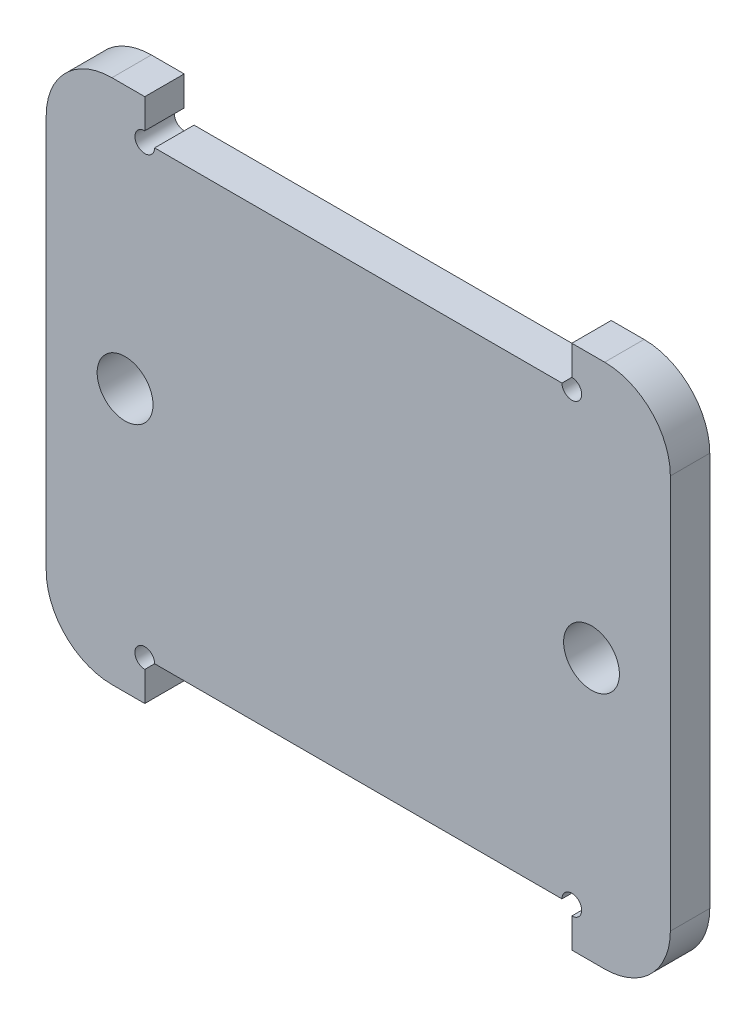
ISO-10303-21;
HEADER;
FILE_DESCRIPTION(('STEP AP214'),'2;1');
FILE_NAME('part.step','',(''),(''),'','','');
FILE_SCHEMA(('AUTOMOTIVE_DESIGN { 1 0 10303 214 1 1 1 1 }'));
ENDSEC;
DATA;
#1=APPLICATION_CONTEXT('core data for automotive mechanical design processes');
#2=APPLICATION_PROTOCOL_DEFINITION('international standard','automotive_design',2000,#1);
#3=PRODUCT_CONTEXT('',#1,'mechanical');
#4=PRODUCT('Part','Part','',(#3));
#5=PRODUCT_RELATED_PRODUCT_CATEGORY('part','',(#4));
#6=PRODUCT_DEFINITION_FORMATION('','',#4);
#7=PRODUCT_DEFINITION_CONTEXT('part definition',#1,'design');
#8=PRODUCT_DEFINITION('design','',#6,#7);
#9=PRODUCT_DEFINITION_SHAPE('','',#8);
#10=(LENGTH_UNIT() NAMED_UNIT(*) SI_UNIT(.MILLI.,.METRE.));
#11=(NAMED_UNIT(*) PLANE_ANGLE_UNIT() SI_UNIT($,.RADIAN.));
#12=(NAMED_UNIT(*) SI_UNIT($,.STERADIAN.) SOLID_ANGLE_UNIT());
#13=UNCERTAINTY_MEASURE_WITH_UNIT(LENGTH_MEASURE(1.E-05),#10,'distance_accuracy_value','');
#14=(GEOMETRIC_REPRESENTATION_CONTEXT(3) GLOBAL_UNCERTAINTY_ASSIGNED_CONTEXT((#13)) GLOBAL_UNIT_ASSIGNED_CONTEXT((#10,
#11,#12)) REPRESENTATION_CONTEXT('',''));
#15=CARTESIAN_POINT('',(0.,0.,0.));
#16=DIRECTION('',(0.,0.,1.));
#17=DIRECTION('',(1.,0.,0.));
#18=AXIS2_PLACEMENT_3D('',#15,#16,#17);
#19=CARTESIAN_POINT('',(32.5,-34.,6.));
#20=DIRECTION('',(0.,0.,1.));
#21=DIRECTION('',(1.,0.,0.));
#22=AXIS2_PLACEMENT_3D('',#19,#20,#21);
#23=PLANE('',#22);
#24=CARTESIAN_POINT('',(35.5,0.,6.));
#25=DIRECTION('',(0.,0.,1.));
#26=DIRECTION('',(-1.,0.,0.));
#27=AXIS2_PLACEMENT_3D('',#24,#25,#26);
#28=CIRCLE('',#27,4.25000000000001);
#29=CARTESIAN_POINT('',(31.25,0.,6.));
#30=VERTEX_POINT('',#29);
#31=EDGE_CURVE('E236',#30,#30,#28,.T.);
#32=ORIENTED_EDGE('',*,*,#31,.F.);
#33=EDGE_LOOP('',(#32));
#34=FACE_BOUND('',#33,.T.);
#35=DIRECTION('',(0.,-1.,0.));
#36=VECTOR('',#35,1.);
#37=CARTESIAN_POINT('',(-47.5,-40.,6.));
#38=LINE('',#37,#36);
#39=CARTESIAN_POINT('',(-47.5,30.,6.));
#40=VERTEX_POINT('',#39);
#41=CARTESIAN_POINT('',(-47.5,-30.,6.));
#42=VERTEX_POINT('',#41);
#43=EDGE_CURVE('E328',#40,#42,#38,.T.);
#44=ORIENTED_EDGE('',*,*,#43,.T.);
#45=CARTESIAN_POINT('',(-37.5,-30.,6.));
#46=DIRECTION('',(0.,0.,1.));
#47=DIRECTION('',(1.,0.,0.));
#48=AXIS2_PLACEMENT_3D('',#45,#46,#47);
#49=CIRCLE('',#48,10.);
#50=CARTESIAN_POINT('',(-37.5,-40.,6.));
#51=VERTEX_POINT('',#50);
#52=EDGE_CURVE('E221',#42,#51,#49,.T.);
#53=ORIENTED_EDGE('',*,*,#52,.T.);
#54=DIRECTION('',(1.,0.,0.));
#55=VECTOR('',#54,1.);
#56=CARTESIAN_POINT('',(-47.5,-40.,6.));
#57=LINE('',#56,#55);
#58=CARTESIAN_POINT('',(-32.5,-40.,6.));
#59=VERTEX_POINT('',#58);
#60=EDGE_CURVE('E334',#51,#59,#57,.T.);
#61=ORIENTED_EDGE('',*,*,#60,.T.);
#62=DIRECTION('',(0.,1.,0.));
#63=VECTOR('',#62,1.);
#64=CARTESIAN_POINT('',(-32.5,-40.,6.));
#65=LINE('',#64,#63);
#66=CARTESIAN_POINT('',(-32.5,-35.5,6.));
#67=VERTEX_POINT('',#66);
#68=EDGE_CURVE('E336',#59,#67,#65,.T.);
#69=ORIENTED_EDGE('',*,*,#68,.T.);
#70=CARTESIAN_POINT('',(-32.5,-34.,6.));
#71=DIRECTION('',(0.,0.,-1.));
#72=DIRECTION('',(-1.,0.,0.));
#73=AXIS2_PLACEMENT_3D('',#70,#71,#72);
#74=CIRCLE('',#73,1.5);
#75=CARTESIAN_POINT('',(-31.,-34.,6.));
#76=VERTEX_POINT('',#75);
#77=EDGE_CURVE('E338',#67,#76,#74,.T.);
#78=ORIENTED_EDGE('',*,*,#77,.T.);
#79=DIRECTION('',(1.,0.,0.));
#80=VECTOR('',#79,1.);
#81=CARTESIAN_POINT('',(-31.,-34.,6.));
#82=LINE('',#81,#80);
#83=CARTESIAN_POINT('',(31.,-34.,6.));
#84=VERTEX_POINT('',#83);
#85=EDGE_CURVE('E340',#76,#84,#82,.T.);
#86=ORIENTED_EDGE('',*,*,#85,.T.);
#87=CARTESIAN_POINT('',(32.5,-34.,6.));
#88=DIRECTION('',(0.,0.,-1.));
#89=DIRECTION('',(1.,0.,0.));
#90=AXIS2_PLACEMENT_3D('',#87,#88,#89);
#91=CIRCLE('',#90,1.5);
#92=CARTESIAN_POINT('',(32.5,-35.5,6.));
#93=VERTEX_POINT('',#92);
#94=EDGE_CURVE('E342',#84,#93,#91,.T.);
#95=ORIENTED_EDGE('',*,*,#94,.T.);
#96=DIRECTION('',(0.,-1.,0.));
#97=VECTOR('',#96,1.);
#98=CARTESIAN_POINT('',(32.5,-40.,6.));
#99=LINE('',#98,#97);
#100=CARTESIAN_POINT('',(32.5,-40.,6.));
#101=VERTEX_POINT('',#100);
#102=EDGE_CURVE('E344',#93,#101,#99,.T.);
#103=ORIENTED_EDGE('',*,*,#102,.T.);
#104=DIRECTION('',(1.,0.,0.));
#105=VECTOR('',#104,1.);
#106=CARTESIAN_POINT('',(32.5,-40.,6.));
#107=LINE('',#106,#105);
#108=CARTESIAN_POINT('',(37.5,-40.,6.));
#109=VERTEX_POINT('',#108);
#110=EDGE_CURVE('E345',#101,#109,#107,.T.);
#111=ORIENTED_EDGE('',*,*,#110,.T.);
#112=CARTESIAN_POINT('',(37.5,-30.,6.));
#113=DIRECTION('',(0.,0.,1.));
#114=DIRECTION('',(1.,0.,0.));
#115=AXIS2_PLACEMENT_3D('',#112,#113,#114);
#116=CIRCLE('',#115,10.);
#117=CARTESIAN_POINT('',(47.5,-30.,6.));
#118=VERTEX_POINT('',#117);
#119=EDGE_CURVE('E55',#109,#118,#116,.T.);
#120=ORIENTED_EDGE('',*,*,#119,.T.);
#121=DIRECTION('',(0.,1.,0.));
#122=VECTOR('',#121,1.);
#123=CARTESIAN_POINT('',(47.5,-40.,6.));
#124=LINE('',#123,#122);
#125=CARTESIAN_POINT('',(47.5,30.,6.));
#126=VERTEX_POINT('',#125);
#127=EDGE_CURVE('E244',#118,#126,#124,.T.);
#128=ORIENTED_EDGE('',*,*,#127,.T.);
#129=CARTESIAN_POINT('',(37.5,30.,6.));
#130=DIRECTION('',(0.,0.,1.));
#131=DIRECTION('',(1.,0.,0.));
#132=AXIS2_PLACEMENT_3D('',#129,#130,#131);
#133=CIRCLE('',#132,10.);
#134=CARTESIAN_POINT('',(37.5,40.,6.));
#135=VERTEX_POINT('',#134);
#136=EDGE_CURVE('E176',#126,#135,#133,.T.);
#137=ORIENTED_EDGE('',*,*,#136,.T.);
#138=DIRECTION('',(-1.,0.,0.));
#139=VECTOR('',#138,1.);
#140=CARTESIAN_POINT('',(32.5,40.,6.));
#141=LINE('',#140,#139);
#142=CARTESIAN_POINT('',(32.5,40.,6.));
#143=VERTEX_POINT('',#142);
#144=EDGE_CURVE('E169',#135,#143,#141,.T.);
#145=ORIENTED_EDGE('',*,*,#144,.T.);
#146=DIRECTION('',(0.,-1.,0.));
#147=VECTOR('',#146,1.);
#148=CARTESIAN_POINT('',(32.5,40.,6.));
#149=LINE('',#148,#147);
#150=CARTESIAN_POINT('',(32.5,35.5,6.));
#151=VERTEX_POINT('',#150);
#152=EDGE_CURVE('E173',#143,#151,#149,.T.);
#153=ORIENTED_EDGE('',*,*,#152,.T.);
#154=CARTESIAN_POINT('',(32.5,34.,6.));
#155=DIRECTION('',(0.,0.,-1.));
#156=DIRECTION('',(-1.,0.,0.));
#157=AXIS2_PLACEMENT_3D('',#154,#155,#156);
#158=CIRCLE('',#157,1.5);
#159=CARTESIAN_POINT('',(31.,34.,6.));
#160=VERTEX_POINT('',#159);
#161=EDGE_CURVE('E190',#151,#160,#158,.T.);
#162=ORIENTED_EDGE('',*,*,#161,.T.);
#163=DIRECTION('',(-1.,0.,0.));
#164=VECTOR('',#163,1.);
#165=CARTESIAN_POINT('',(-31.,34.,6.));
#166=LINE('',#165,#164);
#167=CARTESIAN_POINT('',(-31.,34.,6.));
#168=VERTEX_POINT('',#167);
#169=EDGE_CURVE('E309',#160,#168,#166,.T.);
#170=ORIENTED_EDGE('',*,*,#169,.T.);
#171=CARTESIAN_POINT('',(-32.5,34.,6.));
#172=DIRECTION('',(0.,0.,-1.));
#173=DIRECTION('',(1.,0.,0.));
#174=AXIS2_PLACEMENT_3D('',#171,#172,#173);
#175=CIRCLE('',#174,1.5);
#176=CARTESIAN_POINT('',(-32.5,35.5,6.));
#177=VERTEX_POINT('',#176);
#178=EDGE_CURVE('E326',#168,#177,#175,.T.);
#179=ORIENTED_EDGE('',*,*,#178,.T.);
#180=DIRECTION('',(0.,1.,0.));
#181=VECTOR('',#180,1.);
#182=CARTESIAN_POINT('',(-32.5,40.,6.));
#183=LINE('',#182,#181);
#184=CARTESIAN_POINT('',(-32.5,40.,6.));
#185=VERTEX_POINT('',#184);
#186=EDGE_CURVE('E322',#177,#185,#183,.T.);
#187=ORIENTED_EDGE('',*,*,#186,.T.);
#188=DIRECTION('',(-1.,0.,0.));
#189=VECTOR('',#188,1.);
#190=CARTESIAN_POINT('',(-47.5,40.,6.));
#191=LINE('',#190,#189);
#192=CARTESIAN_POINT('',(-37.5,40.,6.));
#193=VERTEX_POINT('',#192);
#194=EDGE_CURVE('E325',#185,#193,#191,.T.);
#195=ORIENTED_EDGE('',*,*,#194,.T.);
#196=CARTESIAN_POINT('',(-37.5,30.,6.));
#197=DIRECTION('',(0.,0.,1.));
#198=DIRECTION('',(1.,0.,0.));
#199=AXIS2_PLACEMENT_3D('',#196,#197,#198);
#200=CIRCLE('',#199,10.);
#201=EDGE_CURVE('E217',#193,#40,#200,.T.);
#202=ORIENTED_EDGE('',*,*,#201,.T.);
#203=EDGE_LOOP('',(#44,#53,#61,#69,#78,#86,#95,#103,#111,#120,#128,#137,#145,#153,#162,#170,
#179,#187,#195,#202));
#204=FACE_BOUND('',#203,.T.);
#205=CARTESIAN_POINT('',(-35.5,0.,6.));
#206=DIRECTION('',(0.,0.,1.));
#207=DIRECTION('',(1.,0.,0.));
#208=AXIS2_PLACEMENT_3D('',#205,#206,#207);
#209=CIRCLE('',#208,4.25000000000001);
#210=CARTESIAN_POINT('',(-31.25,0.,6.));
#211=VERTEX_POINT('',#210);
#212=EDGE_CURVE('E464',#211,#211,#209,.T.);
#213=ORIENTED_EDGE('',*,*,#212,.F.);
#214=EDGE_LOOP('',(#213));
#215=FACE_BOUND('',#214,.T.);
#216=ADVANCED_FACE('F33',(#34,#204,#215),#23,.T.);
#217=CARTESIAN_POINT('',(32.5,-34.,0.));
#218=DIRECTION('',(0.,0.,1.));
#219=DIRECTION('',(1.,0.,0.));
#220=AXIS2_PLACEMENT_3D('',#217,#218,#219);
#221=PLANE('',#220);
#222=DIRECTION('',(1.,0.,0.));
#223=VECTOR('',#222,1.);
#224=CARTESIAN_POINT('',(-47.5,-40.,0.));
#225=LINE('',#224,#223);
#226=CARTESIAN_POINT('',(-37.5,-40.,0.));
#227=VERTEX_POINT('',#226);
#228=CARTESIAN_POINT('',(-32.5,-40.,0.));
#229=VERTEX_POINT('',#228);
#230=EDGE_CURVE('E260',#227,#229,#225,.T.);
#231=ORIENTED_EDGE('',*,*,#230,.F.);
#232=CARTESIAN_POINT('',(-37.5,-30.,0.));
#233=DIRECTION('',(0.,0.,1.));
#234=DIRECTION('',(1.,0.,0.));
#235=AXIS2_PLACEMENT_3D('',#232,#233,#234);
#236=CIRCLE('',#235,10.);
#237=CARTESIAN_POINT('',(-47.5,-30.,0.));
#238=VERTEX_POINT('',#237);
#239=EDGE_CURVE('E210',#227,#238,#236,.F.);
#240=ORIENTED_EDGE('',*,*,#239,.T.);
#241=DIRECTION('',(0.,-1.,0.));
#242=VECTOR('',#241,1.);
#243=CARTESIAN_POINT('',(-47.5,-40.,0.));
#244=LINE('',#243,#242);
#245=CARTESIAN_POINT('',(-47.5,30.,0.));
#246=VERTEX_POINT('',#245);
#247=EDGE_CURVE('E257',#246,#238,#244,.T.);
#248=ORIENTED_EDGE('',*,*,#247,.F.);
#249=CARTESIAN_POINT('',(-37.5,30.,0.));
#250=DIRECTION('',(0.,0.,1.));
#251=DIRECTION('',(1.,0.,0.));
#252=AXIS2_PLACEMENT_3D('',#249,#250,#251);
#253=CIRCLE('',#252,10.);
#254=CARTESIAN_POINT('',(-37.5,40.,0.));
#255=VERTEX_POINT('',#254);
#256=EDGE_CURVE('E199',#246,#255,#253,.F.);
#257=ORIENTED_EDGE('',*,*,#256,.T.);
#258=DIRECTION('',(-1.,0.,0.));
#259=VECTOR('',#258,1.);
#260=CARTESIAN_POINT('',(-47.5,40.,0.));
#261=LINE('',#260,#259);
#262=CARTESIAN_POINT('',(-32.5,40.,0.));
#263=VERTEX_POINT('',#262);
#264=EDGE_CURVE('E254',#263,#255,#261,.T.);
#265=ORIENTED_EDGE('',*,*,#264,.F.);
#266=DIRECTION('',(0.,1.,0.));
#267=VECTOR('',#266,1.);
#268=CARTESIAN_POINT('',(-32.5,40.,0.));
#269=LINE('',#268,#267);
#270=CARTESIAN_POINT('',(-32.5,35.5,0.));
#271=VERTEX_POINT('',#270);
#272=EDGE_CURVE('E252',#271,#263,#269,.T.);
#273=ORIENTED_EDGE('',*,*,#272,.F.);
#274=CARTESIAN_POINT('',(-32.5,34.,0.));
#275=DIRECTION('',(0.,0.,-1.));
#276=DIRECTION('',(1.,0.,0.));
#277=AXIS2_PLACEMENT_3D('',#274,#275,#276);
#278=CIRCLE('',#277,1.5);
#279=CARTESIAN_POINT('',(-31.,34.,0.));
#280=VERTEX_POINT('',#279);
#281=EDGE_CURVE('E250',#280,#271,#278,.T.);
#282=ORIENTED_EDGE('',*,*,#281,.F.);
#283=DIRECTION('',(-1.,0.,0.));
#284=VECTOR('',#283,1.);
#285=CARTESIAN_POINT('',(-31.,34.,0.));
#286=LINE('',#285,#284);
#287=CARTESIAN_POINT('',(31.,34.,0.));
#288=VERTEX_POINT('',#287);
#289=EDGE_CURVE('E248',#288,#280,#286,.T.);
#290=ORIENTED_EDGE('',*,*,#289,.F.);
#291=CARTESIAN_POINT('',(32.5,34.,0.));
#292=DIRECTION('',(0.,0.,-1.));
#293=DIRECTION('',(-1.,0.,0.));
#294=AXIS2_PLACEMENT_3D('',#291,#292,#293);
#295=CIRCLE('',#294,1.5);
#296=CARTESIAN_POINT('',(32.5,35.5,0.));
#297=VERTEX_POINT('',#296);
#298=EDGE_CURVE('E238',#297,#288,#295,.T.);
#299=ORIENTED_EDGE('',*,*,#298,.F.);
#300=DIRECTION('',(0.,-1.,0.));
#301=VECTOR('',#300,1.);
#302=CARTESIAN_POINT('',(32.5,40.,0.));
#303=LINE('',#302,#301);
#304=CARTESIAN_POINT('',(32.5,40.,0.));
#305=VERTEX_POINT('',#304);
#306=EDGE_CURVE('E235',#305,#297,#303,.T.);
#307=ORIENTED_EDGE('',*,*,#306,.F.);
#308=DIRECTION('',(-1.,0.,0.));
#309=VECTOR('',#308,1.);
#310=CARTESIAN_POINT('',(32.5,40.,0.));
#311=LINE('',#310,#309);
#312=CARTESIAN_POINT('',(37.5,40.,0.));
#313=VERTEX_POINT('',#312);
#314=EDGE_CURVE('E194',#313,#305,#311,.T.);
#315=ORIENTED_EDGE('',*,*,#314,.F.);
#316=CARTESIAN_POINT('',(37.5,30.,0.));
#317=DIRECTION('',(0.,0.,1.));
#318=DIRECTION('',(1.,0.,0.));
#319=AXIS2_PLACEMENT_3D('',#316,#317,#318);
#320=CIRCLE('',#319,10.);
#321=CARTESIAN_POINT('',(47.5,30.,0.));
#322=VERTEX_POINT('',#321);
#323=EDGE_CURVE('E206',#313,#322,#320,.F.);
#324=ORIENTED_EDGE('',*,*,#323,.T.);
#325=DIRECTION('',(0.,1.,0.));
#326=VECTOR('',#325,1.);
#327=CARTESIAN_POINT('',(47.5,-40.,0.));
#328=LINE('',#327,#326);
#329=CARTESIAN_POINT('',(47.5,-30.,0.));
#330=VERTEX_POINT('',#329);
#331=EDGE_CURVE('E181',#330,#322,#328,.T.);
#332=ORIENTED_EDGE('',*,*,#331,.F.);
#333=CARTESIAN_POINT('',(37.5,-30.,0.));
#334=DIRECTION('',(0.,0.,1.));
#335=DIRECTION('',(1.,0.,0.));
#336=AXIS2_PLACEMENT_3D('',#333,#334,#335);
#337=CIRCLE('',#336,10.);
#338=CARTESIAN_POINT('',(37.5,-40.,0.));
#339=VERTEX_POINT('',#338);
#340=EDGE_CURVE('E208',#330,#339,#337,.F.);
#341=ORIENTED_EDGE('',*,*,#340,.T.);
#342=DIRECTION('',(1.,0.,0.));
#343=VECTOR('',#342,1.);
#344=CARTESIAN_POINT('',(32.5,-40.,0.));
#345=LINE('',#344,#343);
#346=CARTESIAN_POINT('',(32.5,-40.,0.));
#347=VERTEX_POINT('',#346);
#348=EDGE_CURVE('E272',#347,#339,#345,.T.);
#349=ORIENTED_EDGE('',*,*,#348,.F.);
#350=DIRECTION('',(0.,-1.,0.));
#351=VECTOR('',#350,1.);
#352=CARTESIAN_POINT('',(32.5,-40.,0.));
#353=LINE('',#352,#351);
#354=CARTESIAN_POINT('',(32.5,-35.5,0.));
#355=VERTEX_POINT('',#354);
#356=EDGE_CURVE('E270',#355,#347,#353,.T.);
#357=ORIENTED_EDGE('',*,*,#356,.F.);
#358=CARTESIAN_POINT('',(32.5,-34.,0.));
#359=DIRECTION('',(0.,0.,-1.));
#360=DIRECTION('',(1.,0.,0.));
#361=AXIS2_PLACEMENT_3D('',#358,#359,#360);
#362=CIRCLE('',#361,1.5);
#363=CARTESIAN_POINT('',(31.,-34.,0.));
#364=VERTEX_POINT('',#363);
#365=EDGE_CURVE('E268',#364,#355,#362,.T.);
#366=ORIENTED_EDGE('',*,*,#365,.F.);
#367=DIRECTION('',(1.,0.,0.));
#368=VECTOR('',#367,1.);
#369=CARTESIAN_POINT('',(-31.,-34.,0.));
#370=LINE('',#369,#368);
#371=CARTESIAN_POINT('',(-31.,-34.,0.));
#372=VERTEX_POINT('',#371);
#373=EDGE_CURVE('E266',#372,#364,#370,.T.);
#374=ORIENTED_EDGE('',*,*,#373,.F.);
#375=CARTESIAN_POINT('',(-32.5,-34.,0.));
#376=DIRECTION('',(0.,0.,-1.));
#377=DIRECTION('',(-1.,0.,0.));
#378=AXIS2_PLACEMENT_3D('',#375,#376,#377);
#379=CIRCLE('',#378,1.5);
#380=CARTESIAN_POINT('',(-32.5,-35.5,0.));
#381=VERTEX_POINT('',#380);
#382=EDGE_CURVE('E264',#381,#372,#379,.T.);
#383=ORIENTED_EDGE('',*,*,#382,.F.);
#384=DIRECTION('',(0.,1.,0.));
#385=VECTOR('',#384,1.);
#386=CARTESIAN_POINT('',(-32.5,-40.,0.));
#387=LINE('',#386,#385);
#388=EDGE_CURVE('E262',#229,#381,#387,.T.);
#389=ORIENTED_EDGE('',*,*,#388,.F.);
#390=EDGE_LOOP('',(#231,#240,#248,#257,#265,#273,#282,#290,#299,#307,#315,#324,#332,#341,#349,
#357,#366,#374,#383,#389));
#391=FACE_BOUND('',#390,.T.);
#392=CARTESIAN_POINT('',(35.5,0.,0.));
#393=DIRECTION('',(0.,0.,1.));
#394=DIRECTION('',(-1.,0.,0.));
#395=AXIS2_PLACEMENT_3D('',#392,#393,#394);
#396=CIRCLE('',#395,4.25000000000001);
#397=CARTESIAN_POINT('',(31.25,0.,0.));
#398=VERTEX_POINT('',#397);
#399=EDGE_CURVE('E241',#398,#398,#396,.T.);
#400=ORIENTED_EDGE('',*,*,#399,.T.);
#401=EDGE_LOOP('',(#400));
#402=FACE_BOUND('',#401,.T.);
#403=CARTESIAN_POINT('',(-35.5,0.,0.));
#404=DIRECTION('',(0.,0.,1.));
#405=DIRECTION('',(1.,0.,0.));
#406=AXIS2_PLACEMENT_3D('',#403,#404,#405);
#407=CIRCLE('',#406,4.25000000000001);
#408=CARTESIAN_POINT('',(-31.25,0.,0.));
#409=VERTEX_POINT('',#408);
#410=EDGE_CURVE('E467',#409,#409,#407,.T.);
#411=ORIENTED_EDGE('',*,*,#410,.T.);
#412=EDGE_LOOP('',(#411));
#413=FACE_BOUND('',#412,.T.);
#414=ADVANCED_FACE('F231',(#391,#402,#413),#221,.F.);
#415=CARTESIAN_POINT('',(32.5,40.,6.));
#416=DIRECTION('',(0.,-1.,0.));
#417=DIRECTION('',(1.,0.,0.));
#418=AXIS2_PLACEMENT_3D('',#415,#416,#417);
#419=PLANE('',#418);
#420=ORIENTED_EDGE('',*,*,#144,.F.);
#421=DIRECTION('',(0.,0.,-1.));
#422=VECTOR('',#421,1.);
#423=CARTESIAN_POINT('',(37.5,40.,6.));
#424=LINE('',#423,#422);
#425=EDGE_CURVE('E41',#135,#313,#424,.T.);
#426=ORIENTED_EDGE('',*,*,#425,.T.);
#427=ORIENTED_EDGE('',*,*,#314,.T.);
#428=DIRECTION('',(0.,0.,-1.));
#429=VECTOR('',#428,1.);
#430=CARTESIAN_POINT('',(32.5,40.,6.));
#431=LINE('',#430,#429);
#432=EDGE_CURVE('E186',#143,#305,#431,.T.);
#433=ORIENTED_EDGE('',*,*,#432,.F.);
#434=EDGE_LOOP('',(#420,#426,#427,#433));
#435=FACE_BOUND('',#434,.T.);
#436=ADVANCED_FACE('F192',(#435),#419,.F.);
#437=CARTESIAN_POINT('',(32.5,40.,6.));
#438=DIRECTION('',(1.,0.,0.));
#439=DIRECTION('',(0.,1.,0.));
#440=AXIS2_PLACEMENT_3D('',#437,#438,#439);
#441=PLANE('',#440);
#442=ORIENTED_EDGE('',*,*,#306,.T.);
#443=DIRECTION('',(0.,0.,-1.));
#444=VECTOR('',#443,1.);
#445=CARTESIAN_POINT('',(32.5,35.5,6.));
#446=LINE('',#445,#444);
#447=EDGE_CURVE('E188',#151,#297,#446,.T.);
#448=ORIENTED_EDGE('',*,*,#447,.F.);
#449=ORIENTED_EDGE('',*,*,#152,.F.);
#450=ORIENTED_EDGE('',*,*,#432,.T.);
#451=EDGE_LOOP('',(#442,#448,#449,#450));
#452=FACE_BOUND('',#451,.T.);
#453=ADVANCED_FACE('F185',(#452),#441,.F.);
#454=CARTESIAN_POINT('',(32.5,34.,6.));
#455=DIRECTION('',(0.,0.,-1.));
#456=DIRECTION('',(-1.,0.,0.));
#457=AXIS2_PLACEMENT_3D('',#454,#455,#456);
#458=CYLINDRICAL_SURFACE('',#457,1.5);
#459=ORIENTED_EDGE('',*,*,#298,.T.);
#460=DIRECTION('',(0.,0.,-1.));
#461=VECTOR('',#460,1.);
#462=CARTESIAN_POINT('',(31.,34.,6.));
#463=LINE('',#462,#461);
#464=EDGE_CURVE('E201',#160,#288,#463,.T.);
#465=ORIENTED_EDGE('',*,*,#464,.F.);
#466=ORIENTED_EDGE('',*,*,#161,.F.);
#467=ORIENTED_EDGE('',*,*,#447,.T.);
#468=EDGE_LOOP('',(#459,#465,#466,#467));
#469=FACE_BOUND('',#468,.T.);
#470=ADVANCED_FACE('F416',(#469),#458,.F.);
#471=CARTESIAN_POINT('',(-31.,34.,6.));
#472=DIRECTION('',(0.,-1.,0.));
#473=DIRECTION('',(0.,0.,-1.));
#474=AXIS2_PLACEMENT_3D('',#471,#472,#473);
#475=PLANE('',#474);
#476=ORIENTED_EDGE('',*,*,#289,.T.);
#477=DIRECTION('',(0.,0.,-1.));
#478=VECTOR('',#477,1.);
#479=CARTESIAN_POINT('',(-31.,34.,6.));
#480=LINE('',#479,#478);
#481=EDGE_CURVE('E300',#168,#280,#480,.T.);
#482=ORIENTED_EDGE('',*,*,#481,.F.);
#483=ORIENTED_EDGE('',*,*,#169,.F.);
#484=ORIENTED_EDGE('',*,*,#464,.T.);
#485=EDGE_LOOP('',(#476,#482,#483,#484));
#486=FACE_BOUND('',#485,.T.);
#487=ADVANCED_FACE('F307',(#486),#475,.F.);
#488=CARTESIAN_POINT('',(-32.5,34.,6.));
#489=DIRECTION('',(0.,0.,-1.));
#490=DIRECTION('',(-1.,0.,0.));
#491=AXIS2_PLACEMENT_3D('',#488,#489,#490);
#492=CYLINDRICAL_SURFACE('',#491,1.5);
#493=ORIENTED_EDGE('',*,*,#281,.T.);
#494=DIRECTION('',(0.,0.,-1.));
#495=VECTOR('',#494,1.);
#496=CARTESIAN_POINT('',(-32.5,35.5,6.));
#497=LINE('',#496,#495);
#498=EDGE_CURVE('E297',#177,#271,#497,.T.);
#499=ORIENTED_EDGE('',*,*,#498,.F.);
#500=ORIENTED_EDGE('',*,*,#178,.F.);
#501=ORIENTED_EDGE('',*,*,#481,.T.);
#502=EDGE_LOOP('',(#493,#499,#500,#501));
#503=FACE_BOUND('',#502,.T.);
#504=ADVANCED_FACE('F316',(#503),#492,.F.);
#505=CARTESIAN_POINT('',(-32.5,40.,6.));
#506=DIRECTION('',(-1.,0.,0.));
#507=DIRECTION('',(0.,-1.,0.));
#508=AXIS2_PLACEMENT_3D('',#505,#506,#507);
#509=PLANE('',#508);
#510=ORIENTED_EDGE('',*,*,#272,.T.);
#511=DIRECTION('',(0.,0.,-1.));
#512=VECTOR('',#511,1.);
#513=CARTESIAN_POINT('',(-32.5,40.,6.));
#514=LINE('',#513,#512);
#515=EDGE_CURVE('E294',#185,#263,#514,.T.);
#516=ORIENTED_EDGE('',*,*,#515,.F.);
#517=ORIENTED_EDGE('',*,*,#186,.F.);
#518=ORIENTED_EDGE('',*,*,#498,.T.);
#519=EDGE_LOOP('',(#510,#516,#517,#518));
#520=FACE_BOUND('',#519,.T.);
#521=ADVANCED_FACE('F320',(#520),#509,.F.);
#522=CARTESIAN_POINT('',(-47.5,40.,6.));
#523=DIRECTION('',(0.,-1.,0.));
#524=DIRECTION('',(0.,0.,-1.));
#525=AXIS2_PLACEMENT_3D('',#522,#523,#524);
#526=PLANE('',#525);
#527=ORIENTED_EDGE('',*,*,#264,.T.);
#528=DIRECTION('',(0.,0.,-1.));
#529=VECTOR('',#528,1.);
#530=CARTESIAN_POINT('',(-37.5,40.,6.));
#531=LINE('',#530,#529);
#532=EDGE_CURVE('E11',#255,#193,#531,.F.);
#533=ORIENTED_EDGE('',*,*,#532,.T.);
#534=ORIENTED_EDGE('',*,*,#194,.F.);
#535=ORIENTED_EDGE('',*,*,#515,.T.);
#536=EDGE_LOOP('',(#527,#533,#534,#535));
#537=FACE_BOUND('',#536,.T.);
#538=ADVANCED_FACE('F405',(#537),#526,.F.);
#539=CARTESIAN_POINT('',(-47.5,-40.,6.));
#540=DIRECTION('',(1.,0.,0.));
#541=DIRECTION('',(0.,0.,-1.));
#542=AXIS2_PLACEMENT_3D('',#539,#540,#541);
#543=PLANE('',#542);
#544=ORIENTED_EDGE('',*,*,#247,.T.);
#545=DIRECTION('',(0.,0.,-1.));
#546=VECTOR('',#545,1.);
#547=CARTESIAN_POINT('',(-47.5,-30.,6.));
#548=LINE('',#547,#546);
#549=EDGE_CURVE('E215',#238,#42,#548,.F.);
#550=ORIENTED_EDGE('',*,*,#549,.T.);
#551=ORIENTED_EDGE('',*,*,#43,.F.);
#552=DIRECTION('',(0.,0.,-1.));
#553=VECTOR('',#552,1.);
#554=CARTESIAN_POINT('',(-47.5,30.,6.));
#555=LINE('',#554,#553);
#556=EDGE_CURVE('E212',#40,#246,#555,.T.);
#557=ORIENTED_EDGE('',*,*,#556,.T.);
#558=EDGE_LOOP('',(#544,#550,#551,#557));
#559=FACE_BOUND('',#558,.T.);
#560=ADVANCED_FACE('F401',(#559),#543,.F.);
#561=CARTESIAN_POINT('',(-47.5,-40.,6.));
#562=DIRECTION('',(0.,1.,0.));
#563=DIRECTION('',(-1.,0.,0.));
#564=AXIS2_PLACEMENT_3D('',#561,#562,#563);
#565=PLANE('',#564);
#566=ORIENTED_EDGE('',*,*,#60,.F.);
#567=DIRECTION('',(0.,0.,-1.));
#568=VECTOR('',#567,1.);
#569=CARTESIAN_POINT('',(-37.5,-40.,6.));
#570=LINE('',#569,#568);
#571=EDGE_CURVE('E196',#51,#227,#570,.T.);
#572=ORIENTED_EDGE('',*,*,#571,.T.);
#573=ORIENTED_EDGE('',*,*,#230,.T.);
#574=DIRECTION('',(0.,0.,-1.));
#575=VECTOR('',#574,1.);
#576=CARTESIAN_POINT('',(-32.5,-40.,6.));
#577=LINE('',#576,#575);
#578=EDGE_CURVE('E291',#59,#229,#577,.T.);
#579=ORIENTED_EDGE('',*,*,#578,.F.);
#580=EDGE_LOOP('',(#566,#572,#573,#579));
#581=FACE_BOUND('',#580,.T.);
#582=ADVANCED_FACE('F397',(#581),#565,.F.);
#583=CARTESIAN_POINT('',(-32.5,-40.,6.));
#584=DIRECTION('',(-1.,0.,0.));
#585=DIRECTION('',(0.,-1.,0.));
#586=AXIS2_PLACEMENT_3D('',#583,#584,#585);
#587=PLANE('',#586);
#588=ORIENTED_EDGE('',*,*,#388,.T.);
#589=DIRECTION('',(0.,0.,-1.));
#590=VECTOR('',#589,1.);
#591=CARTESIAN_POINT('',(-32.5,-35.5,6.));
#592=LINE('',#591,#590);
#593=EDGE_CURVE('E288',#67,#381,#592,.T.);
#594=ORIENTED_EDGE('',*,*,#593,.F.);
#595=ORIENTED_EDGE('',*,*,#68,.F.);
#596=ORIENTED_EDGE('',*,*,#578,.T.);
#597=EDGE_LOOP('',(#588,#594,#595,#596));
#598=FACE_BOUND('',#597,.T.);
#599=ADVANCED_FACE('F393',(#598),#587,.F.);
#600=CARTESIAN_POINT('',(-32.5,-34.,6.));
#601=DIRECTION('',(0.,0.,-1.));
#602=DIRECTION('',(-1.,0.,0.));
#603=AXIS2_PLACEMENT_3D('',#600,#601,#602);
#604=CYLINDRICAL_SURFACE('',#603,1.5);
#605=ORIENTED_EDGE('',*,*,#382,.T.);
#606=DIRECTION('',(0.,0.,-1.));
#607=VECTOR('',#606,1.);
#608=CARTESIAN_POINT('',(-31.,-34.,6.));
#609=LINE('',#608,#607);
#610=EDGE_CURVE('E285',#76,#372,#609,.T.);
#611=ORIENTED_EDGE('',*,*,#610,.F.);
#612=ORIENTED_EDGE('',*,*,#77,.F.);
#613=ORIENTED_EDGE('',*,*,#593,.T.);
#614=EDGE_LOOP('',(#605,#611,#612,#613));
#615=FACE_BOUND('',#614,.T.);
#616=ADVANCED_FACE('F389',(#615),#604,.F.);
#617=CARTESIAN_POINT('',(-31.,-34.,6.));
#618=DIRECTION('',(0.,1.,0.));
#619=DIRECTION('',(0.,0.,1.));
#620=AXIS2_PLACEMENT_3D('',#617,#618,#619);
#621=PLANE('',#620);
#622=ORIENTED_EDGE('',*,*,#373,.T.);
#623=DIRECTION('',(0.,0.,-1.));
#624=VECTOR('',#623,1.);
#625=CARTESIAN_POINT('',(31.,-34.,6.));
#626=LINE('',#625,#624);
#627=EDGE_CURVE('E282',#84,#364,#626,.T.);
#628=ORIENTED_EDGE('',*,*,#627,.F.);
#629=ORIENTED_EDGE('',*,*,#85,.F.);
#630=ORIENTED_EDGE('',*,*,#610,.T.);
#631=EDGE_LOOP('',(#622,#628,#629,#630));
#632=FACE_BOUND('',#631,.T.);
#633=ADVANCED_FACE('F385',(#632),#621,.F.);
#634=CARTESIAN_POINT('',(32.5,-34.,6.));
#635=DIRECTION('',(0.,0.,-1.));
#636=DIRECTION('',(-1.,0.,0.));
#637=AXIS2_PLACEMENT_3D('',#634,#635,#636);
#638=CYLINDRICAL_SURFACE('',#637,1.5);
#639=ORIENTED_EDGE('',*,*,#365,.T.);
#640=DIRECTION('',(0.,0.,-1.));
#641=VECTOR('',#640,1.);
#642=CARTESIAN_POINT('',(32.5,-35.5,6.));
#643=LINE('',#642,#641);
#644=EDGE_CURVE('E279',#93,#355,#643,.T.);
#645=ORIENTED_EDGE('',*,*,#644,.F.);
#646=ORIENTED_EDGE('',*,*,#94,.F.);
#647=ORIENTED_EDGE('',*,*,#627,.T.);
#648=EDGE_LOOP('',(#639,#645,#646,#647));
#649=FACE_BOUND('',#648,.T.);
#650=ADVANCED_FACE('F381',(#649),#638,.F.);
#651=CARTESIAN_POINT('',(32.5,-40.,6.));
#652=DIRECTION('',(1.,0.,0.));
#653=DIRECTION('',(0.,1.,0.));
#654=AXIS2_PLACEMENT_3D('',#651,#652,#653);
#655=PLANE('',#654);
#656=ORIENTED_EDGE('',*,*,#356,.T.);
#657=DIRECTION('',(0.,0.,-1.));
#658=VECTOR('',#657,1.);
#659=CARTESIAN_POINT('',(32.5,-40.,6.));
#660=LINE('',#659,#658);
#661=EDGE_CURVE('E276',#101,#347,#660,.T.);
#662=ORIENTED_EDGE('',*,*,#661,.F.);
#663=ORIENTED_EDGE('',*,*,#102,.F.);
#664=ORIENTED_EDGE('',*,*,#644,.T.);
#665=EDGE_LOOP('',(#656,#662,#663,#664));
#666=FACE_BOUND('',#665,.T.);
#667=ADVANCED_FACE('F377',(#666),#655,.F.);
#668=CARTESIAN_POINT('',(32.5,-40.,6.));
#669=DIRECTION('',(0.,1.,0.));
#670=DIRECTION('',(-1.,0.,0.));
#671=AXIS2_PLACEMENT_3D('',#668,#669,#670);
#672=PLANE('',#671);
#673=ORIENTED_EDGE('',*,*,#348,.T.);
#674=DIRECTION('',(0.,0.,-1.));
#675=VECTOR('',#674,1.);
#676=CARTESIAN_POINT('',(37.5,-40.,6.));
#677=LINE('',#676,#675);
#678=EDGE_CURVE('E227',#339,#109,#677,.F.);
#679=ORIENTED_EDGE('',*,*,#678,.T.);
#680=ORIENTED_EDGE('',*,*,#110,.F.);
#681=ORIENTED_EDGE('',*,*,#661,.T.);
#682=EDGE_LOOP('',(#673,#679,#680,#681));
#683=FACE_BOUND('',#682,.T.);
#684=ADVANCED_FACE('F374',(#683),#672,.F.);
#685=CARTESIAN_POINT('',(47.5,-40.,6.));
#686=DIRECTION('',(-1.,0.,0.));
#687=DIRECTION('',(0.,0.,1.));
#688=AXIS2_PLACEMENT_3D('',#685,#686,#687);
#689=PLANE('',#688);
#690=ORIENTED_EDGE('',*,*,#127,.F.);
#691=DIRECTION('',(0.,0.,-1.));
#692=VECTOR('',#691,1.);
#693=CARTESIAN_POINT('',(47.5,-30.,6.));
#694=LINE('',#693,#692);
#695=EDGE_CURVE('E224',#118,#330,#694,.T.);
#696=ORIENTED_EDGE('',*,*,#695,.T.);
#697=ORIENTED_EDGE('',*,*,#331,.T.);
#698=DIRECTION('',(0.,0.,-1.));
#699=VECTOR('',#698,1.);
#700=CARTESIAN_POINT('',(47.5,30.,6.));
#701=LINE('',#700,#699);
#702=EDGE_CURVE('E48',#322,#126,#701,.F.);
#703=ORIENTED_EDGE('',*,*,#702,.T.);
#704=EDGE_LOOP('',(#690,#696,#697,#703));
#705=FACE_BOUND('',#704,.T.);
#706=ADVANCED_FACE('F371',(#705),#689,.F.);
#707=CARTESIAN_POINT('',(35.5,0.,6.));
#708=DIRECTION('',(0.,0.,-1.));
#709=DIRECTION('',(-1.,0.,0.));
#710=AXIS2_PLACEMENT_3D('',#707,#708,#709);
#711=CYLINDRICAL_SURFACE('',#710,4.25000000000001);
#712=ORIENTED_EDGE('',*,*,#31,.T.);
#713=EDGE_LOOP('',(#712));
#714=FACE_BOUND('',#713,.T.);
#715=ORIENTED_EDGE('',*,*,#399,.F.);
#716=EDGE_LOOP('',(#715));
#717=FACE_BOUND('',#716,.T.);
#718=ADVANCED_FACE('F368',(#714,#717),#711,.F.);
#719=CARTESIAN_POINT('',(-35.5,0.,6.));
#720=DIRECTION('',(0.,0.,-1.));
#721=DIRECTION('',(-1.,0.,0.));
#722=AXIS2_PLACEMENT_3D('',#719,#720,#721);
#723=CYLINDRICAL_SURFACE('',#722,4.25000000000001);
#724=ORIENTED_EDGE('',*,*,#212,.T.);
#725=EDGE_LOOP('',(#724));
#726=FACE_BOUND('',#725,.T.);
#727=ORIENTED_EDGE('',*,*,#410,.F.);
#728=EDGE_LOOP('',(#727));
#729=FACE_BOUND('',#728,.T.);
#730=ADVANCED_FACE('F424',(#726,#729),#723,.F.);
#731=CARTESIAN_POINT('',(-37.5,-30.,6.));
#732=DIRECTION('',(0.,0.,-1.));
#733=DIRECTION('',(-1.,0.,0.));
#734=AXIS2_PLACEMENT_3D('',#731,#732,#733);
#735=CYLINDRICAL_SURFACE('',#734,10.);
#736=ORIENTED_EDGE('',*,*,#52,.F.);
#737=ORIENTED_EDGE('',*,*,#549,.F.);
#738=ORIENTED_EDGE('',*,*,#239,.F.);
#739=ORIENTED_EDGE('',*,*,#571,.F.);
#740=EDGE_LOOP('',(#736,#737,#738,#739));
#741=FACE_BOUND('',#740,.T.);
#742=ADVANCED_FACE('F356',(#741),#735,.T.);
#743=CARTESIAN_POINT('',(37.5,-30.,6.));
#744=DIRECTION('',(0.,0.,-1.));
#745=DIRECTION('',(-1.,0.,0.));
#746=AXIS2_PLACEMENT_3D('',#743,#744,#745);
#747=CYLINDRICAL_SURFACE('',#746,10.);
#748=ORIENTED_EDGE('',*,*,#119,.F.);
#749=ORIENTED_EDGE('',*,*,#678,.F.);
#750=ORIENTED_EDGE('',*,*,#340,.F.);
#751=ORIENTED_EDGE('',*,*,#695,.F.);
#752=EDGE_LOOP('',(#748,#749,#750,#751));
#753=FACE_BOUND('',#752,.T.);
#754=ADVANCED_FACE('F350',(#753),#747,.T.);
#755=CARTESIAN_POINT('',(37.5,30.,6.));
#756=DIRECTION('',(0.,0.,-1.));
#757=DIRECTION('',(-1.,0.,0.));
#758=AXIS2_PLACEMENT_3D('',#755,#756,#757);
#759=CYLINDRICAL_SURFACE('',#758,10.);
#760=ORIENTED_EDGE('',*,*,#136,.F.);
#761=ORIENTED_EDGE('',*,*,#702,.F.);
#762=ORIENTED_EDGE('',*,*,#323,.F.);
#763=ORIENTED_EDGE('',*,*,#425,.F.);
#764=EDGE_LOOP('',(#760,#761,#762,#763));
#765=FACE_BOUND('',#764,.T.);
#766=ADVANCED_FACE('F348',(#765),#759,.T.);
#767=CARTESIAN_POINT('',(-37.5,30.,6.));
#768=DIRECTION('',(0.,0.,-1.));
#769=DIRECTION('',(-1.,0.,0.));
#770=AXIS2_PLACEMENT_3D('',#767,#768,#769);
#771=CYLINDRICAL_SURFACE('',#770,10.);
#772=ORIENTED_EDGE('',*,*,#201,.F.);
#773=ORIENTED_EDGE('',*,*,#532,.F.);
#774=ORIENTED_EDGE('',*,*,#256,.F.);
#775=ORIENTED_EDGE('',*,*,#556,.F.);
#776=EDGE_LOOP('',(#772,#773,#774,#775));
#777=FACE_BOUND('',#776,.T.);
#778=ADVANCED_FACE('F35',(#777),#771,.T.);
#779=CLOSED_SHELL('',(#216,#414,#436,#453,#470,#487,#504,#521,#538,#560,#582,#599,#616,#633,
#650,#667,#684,#706,#718,#730,#742,#754,#766,#778));
#780=MANIFOLD_SOLID_BREP('B2',#779);
#781=ADVANCED_BREP_SHAPE_REPRESENTATION('',(#18,#780),#14);
#782=SHAPE_DEFINITION_REPRESENTATION(#9,#781);
ENDSEC;
END-ISO-10303-21;
